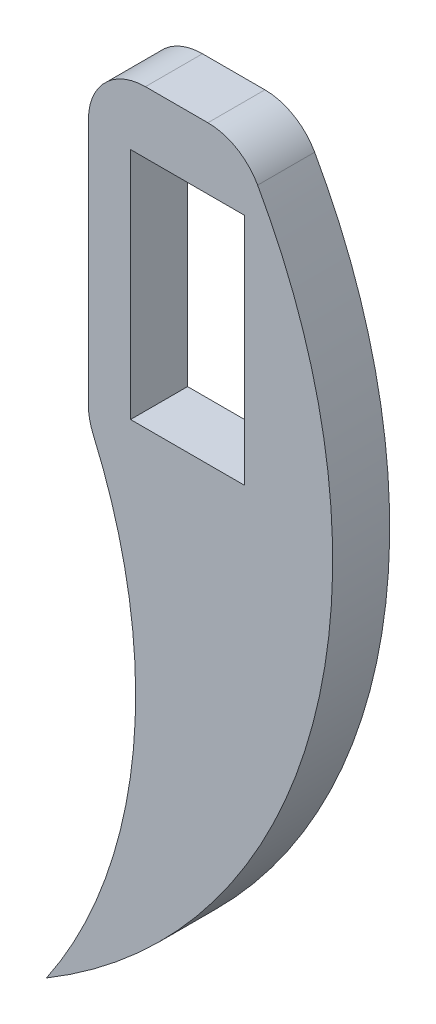
ISO-10303-21;
HEADER;
FILE_DESCRIPTION(('STEP AP214'),'2;1');
FILE_NAME('part.step','',(''),(''),'','','');
FILE_SCHEMA(('AUTOMOTIVE_DESIGN { 1 0 10303 214 1 1 1 1 }'));
ENDSEC;
DATA;
#1=APPLICATION_CONTEXT('core data for automotive mechanical design processes');
#2=APPLICATION_PROTOCOL_DEFINITION('international standard','automotive_design',2000,#1);
#3=PRODUCT_CONTEXT('',#1,'mechanical');
#4=PRODUCT('Part','Part','',(#3));
#5=PRODUCT_RELATED_PRODUCT_CATEGORY('part','',(#4));
#6=PRODUCT_DEFINITION_FORMATION('','',#4);
#7=PRODUCT_DEFINITION_CONTEXT('part definition',#1,'design');
#8=PRODUCT_DEFINITION('design','',#6,#7);
#9=PRODUCT_DEFINITION_SHAPE('','',#8);
#10=(LENGTH_UNIT() NAMED_UNIT(*) SI_UNIT(.MILLI.,.METRE.));
#11=(NAMED_UNIT(*) PLANE_ANGLE_UNIT() SI_UNIT($,.RADIAN.));
#12=(NAMED_UNIT(*) SI_UNIT($,.STERADIAN.) SOLID_ANGLE_UNIT());
#13=UNCERTAINTY_MEASURE_WITH_UNIT(LENGTH_MEASURE(1.E-05),#10,'distance_accuracy_value','');
#14=(GEOMETRIC_REPRESENTATION_CONTEXT(3) GLOBAL_UNCERTAINTY_ASSIGNED_CONTEXT((#13)) GLOBAL_UNIT_ASSIGNED_CONTEXT((#10,
#11,#12)) REPRESENTATION_CONTEXT('',''));
#15=CARTESIAN_POINT('',(0.,0.,0.));
#16=DIRECTION('',(0.,0.,1.));
#17=DIRECTION('',(1.,0.,0.));
#18=AXIS2_PLACEMENT_3D('',#15,#16,#17);
#19=CARTESIAN_POINT('',(-89.2649060375582,-82.4286037994864,10.));
#20=DIRECTION('',(0.,0.,1.));
#21=DIRECTION('',(1.,0.,0.));
#22=AXIS2_PLACEMENT_3D('',#19,#20,#21);
#23=PLANE('',#22);
#24=DIRECTION('',(0.,-1.,0.));
#25=VECTOR('',#24,1.);
#26=CARTESIAN_POINT('',(-7.39194451480431,10.8502665647734,10.));
#27=LINE('',#26,#25);
#28=CARTESIAN_POINT('',(-7.39194451480431,0.85026656477339,10.));
#29=VERTEX_POINT('',#28);
#30=CARTESIAN_POINT('',(-7.3919445148043,-42.5398529711621,10.));
#31=VERTEX_POINT('',#30);
#32=EDGE_CURVE('E172',#29,#31,#27,.T.);
#33=ORIENTED_EDGE('',*,*,#32,.T.);
#34=CARTESIAN_POINT('',(2.6080554851957,-42.5398529711621,10.));
#35=DIRECTION('',(0.,0.,1.));
#36=DIRECTION('',(1.,0.,0.));
#37=AXIS2_PLACEMENT_3D('',#34,#35,#36);
#38=CIRCLE('',#37,10.);
#39=CARTESIAN_POINT('',(-6.56468887205142,-46.5224100588372,10.));
#40=VERTEX_POINT('',#39);
#41=EDGE_CURVE('E45',#31,#40,#38,.T.);
#42=ORIENTED_EDGE('',*,*,#41,.T.);
#43=CARTESIAN_POINT('',(-89.2649060375582,-82.4286037994864,10.));
#44=DIRECTION('',(0.,0.,-1.));
#45=DIRECTION('',(1.,0.,0.));
#46=AXIS2_PLACEMENT_3D('',#43,#44,#45);
#47=CIRCLE('',#46,90.1586416721271);
#48=CARTESIAN_POINT('',(-14.7577899436033,-133.195426819299,10.));
#49=VERTEX_POINT('',#48);
#50=EDGE_CURVE('E164',#40,#49,#47,.T.);
#51=ORIENTED_EDGE('',*,*,#50,.T.);
#52=CARTESIAN_POINT('',(-67.7023851929773,-44.67414923242,10.));
#53=DIRECTION('',(0.,0.,1.));
#54=DIRECTION('',(-1.,0.,0.));
#55=AXIS2_PLACEMENT_3D('',#52,#53,#54);
#56=CIRCLE('',#55,103.146239639326);
#57=CARTESIAN_POINT('',(22.285359818908,5.73767973072294,10.));
#58=VERTEX_POINT('',#57);
#59=EDGE_CURVE('E166',#49,#58,#56,.T.);
#60=ORIENTED_EDGE('',*,*,#59,.T.);
#61=CARTESIAN_POINT('',(13.5610723095865,0.85026656477339,10.));
#62=DIRECTION('',(0.,0.,1.));
#63=DIRECTION('',(1.,0.,0.));
#64=AXIS2_PLACEMENT_3D('',#61,#62,#63);
#65=CIRCLE('',#64,10.);
#66=CARTESIAN_POINT('',(13.5610723095865,10.8502665647734,10.));
#67=VERTEX_POINT('',#66);
#68=EDGE_CURVE('E191',#58,#67,#65,.T.);
#69=ORIENTED_EDGE('',*,*,#68,.T.);
#70=DIRECTION('',(-1.,0.,0.));
#71=VECTOR('',#70,1.);
#72=CARTESIAN_POINT('',(-7.39194451480431,10.8502665647734,10.));
#73=LINE('',#72,#71);
#74=CARTESIAN_POINT('',(2.60805548519569,10.8502665647734,10.));
#75=VERTEX_POINT('',#74);
#76=EDGE_CURVE('E170',#67,#75,#73,.T.);
#77=ORIENTED_EDGE('',*,*,#76,.T.);
#78=CARTESIAN_POINT('',(2.60805548519569,0.850266564773392,10.));
#79=DIRECTION('',(0.,0.,1.));
#80=DIRECTION('',(1.,0.,0.));
#81=AXIS2_PLACEMENT_3D('',#78,#79,#80);
#82=CIRCLE('',#81,10.);
#83=EDGE_CURVE('E204',#75,#29,#82,.T.);
#84=ORIENTED_EDGE('',*,*,#83,.T.);
#85=EDGE_LOOP('',(#33,#42,#51,#60,#69,#77,#84));
#86=FACE_BOUND('',#85,.T.);
#87=DIRECTION('',(1.,0.,0.));
#88=VECTOR('',#87,1.);
#89=CARTESIAN_POINT('',(0.,-41.,10.));
#90=LINE('',#89,#88);
#91=CARTESIAN_POINT('',(0.,-41.,10.));
#92=VERTEX_POINT('',#91);
#93=CARTESIAN_POINT('',(20.,-41.,10.));
#94=VERTEX_POINT('',#93);
#95=EDGE_CURVE('E133',#92,#94,#90,.T.);
#96=ORIENTED_EDGE('',*,*,#95,.F.);
#97=DIRECTION('',(0.,-1.,0.));
#98=VECTOR('',#97,1.);
#99=CARTESIAN_POINT('',(0.,0.,10.));
#100=LINE('',#99,#98);
#101=CARTESIAN_POINT('',(0.,0.,10.));
#102=VERTEX_POINT('',#101);
#103=EDGE_CURVE('E123',#102,#92,#100,.T.);
#104=ORIENTED_EDGE('',*,*,#103,.F.);
#105=DIRECTION('',(-1.,0.,0.));
#106=VECTOR('',#105,1.);
#107=CARTESIAN_POINT('',(0.,0.,10.));
#108=LINE('',#107,#106);
#109=CARTESIAN_POINT('',(20.,0.,10.));
#110=VERTEX_POINT('',#109);
#111=EDGE_CURVE('E148',#110,#102,#108,.T.);
#112=ORIENTED_EDGE('',*,*,#111,.F.);
#113=DIRECTION('',(0.,1.,0.));
#114=VECTOR('',#113,1.);
#115=CARTESIAN_POINT('',(20.,0.,10.));
#116=LINE('',#115,#114);
#117=EDGE_CURVE('E146',#94,#110,#116,.T.);
#118=ORIENTED_EDGE('',*,*,#117,.F.);
#119=EDGE_LOOP('',(#96,#104,#112,#118));
#120=FACE_BOUND('',#119,.T.);
#121=ADVANCED_FACE('F37',(#86,#120),#23,.T.);
#122=CARTESIAN_POINT('',(-89.2649060375582,-82.4286037994864,0.));
#123=DIRECTION('',(0.,0.,1.));
#124=DIRECTION('',(1.,0.,0.));
#125=AXIS2_PLACEMENT_3D('',#122,#123,#124);
#126=PLANE('',#125);
#127=CARTESIAN_POINT('',(-89.2649060375582,-82.4286037994864,0.));
#128=DIRECTION('',(0.,0.,-1.));
#129=DIRECTION('',(1.,0.,0.));
#130=AXIS2_PLACEMENT_3D('',#127,#128,#129);
#131=CIRCLE('',#130,90.1586416721271);
#132=CARTESIAN_POINT('',(-6.56468887205142,-46.5224100588372,0.));
#133=VERTEX_POINT('',#132);
#134=CARTESIAN_POINT('',(-14.7577899436033,-133.195426819299,0.));
#135=VERTEX_POINT('',#134);
#136=EDGE_CURVE('E141',#133,#135,#131,.T.);
#137=ORIENTED_EDGE('',*,*,#136,.F.);
#138=CARTESIAN_POINT('',(2.6080554851957,-42.5398529711621,0.));
#139=DIRECTION('',(0.,0.,1.));
#140=DIRECTION('',(1.,0.,0.));
#141=AXIS2_PLACEMENT_3D('',#138,#139,#140);
#142=CIRCLE('',#141,10.);
#143=CARTESIAN_POINT('',(-7.3919445148043,-42.5398529711621,0.));
#144=VERTEX_POINT('',#143);
#145=EDGE_CURVE('E198',#133,#144,#142,.F.);
#146=ORIENTED_EDGE('',*,*,#145,.T.);
#147=DIRECTION('',(0.,-1.,0.));
#148=VECTOR('',#147,1.);
#149=CARTESIAN_POINT('',(-7.39194451480431,10.8502665647734,0.));
#150=LINE('',#149,#148);
#151=CARTESIAN_POINT('',(-7.39194451480431,0.85026656477339,0.));
#152=VERTEX_POINT('',#151);
#153=EDGE_CURVE('E167',#152,#144,#150,.T.);
#154=ORIENTED_EDGE('',*,*,#153,.F.);
#155=CARTESIAN_POINT('',(2.60805548519569,0.850266564773392,0.));
#156=DIRECTION('',(0.,0.,1.));
#157=DIRECTION('',(1.,0.,0.));
#158=AXIS2_PLACEMENT_3D('',#155,#156,#157);
#159=CIRCLE('',#158,10.);
#160=CARTESIAN_POINT('',(2.60805548519569,10.8502665647734,0.));
#161=VERTEX_POINT('',#160);
#162=EDGE_CURVE('E196',#152,#161,#159,.F.);
#163=ORIENTED_EDGE('',*,*,#162,.T.);
#164=DIRECTION('',(-1.,0.,0.));
#165=VECTOR('',#164,1.);
#166=CARTESIAN_POINT('',(-7.39194451480431,10.8502665647734,0.));
#167=LINE('',#166,#165);
#168=CARTESIAN_POINT('',(13.5610723095865,10.8502665647734,0.));
#169=VERTEX_POINT('',#168);
#170=EDGE_CURVE('E179',#169,#161,#167,.T.);
#171=ORIENTED_EDGE('',*,*,#170,.F.);
#172=CARTESIAN_POINT('',(13.5610723095865,0.85026656477339,0.));
#173=DIRECTION('',(0.,0.,1.));
#174=DIRECTION('',(1.,0.,0.));
#175=AXIS2_PLACEMENT_3D('',#172,#173,#174);
#176=CIRCLE('',#175,10.);
#177=CARTESIAN_POINT('',(22.285359818908,5.73767973072294,0.));
#178=VERTEX_POINT('',#177);
#179=EDGE_CURVE('E187',#169,#178,#176,.F.);
#180=ORIENTED_EDGE('',*,*,#179,.T.);
#181=CARTESIAN_POINT('',(-67.7023851929773,-44.67414923242,0.));
#182=DIRECTION('',(0.,0.,1.));
#183=DIRECTION('',(-1.,0.,0.));
#184=AXIS2_PLACEMENT_3D('',#181,#182,#183);
#185=CIRCLE('',#184,103.146239639326);
#186=EDGE_CURVE('E176',#135,#178,#185,.T.);
#187=ORIENTED_EDGE('',*,*,#186,.F.);
#188=EDGE_LOOP('',(#137,#146,#154,#163,#171,#180,#187));
#189=FACE_BOUND('',#188,.T.);
#190=DIRECTION('',(0.,-1.,0.));
#191=VECTOR('',#190,1.);
#192=CARTESIAN_POINT('',(0.,0.,0.));
#193=LINE('',#192,#191);
#194=CARTESIAN_POINT('',(0.,0.,0.));
#195=VERTEX_POINT('',#194);
#196=CARTESIAN_POINT('',(0.,-41.,0.));
#197=VERTEX_POINT('',#196);
#198=EDGE_CURVE('E152',#195,#197,#193,.T.);
#199=ORIENTED_EDGE('',*,*,#198,.T.);
#200=DIRECTION('',(1.,0.,0.));
#201=VECTOR('',#200,1.);
#202=CARTESIAN_POINT('',(0.,-41.,0.));
#203=LINE('',#202,#201);
#204=CARTESIAN_POINT('',(20.,-41.,0.));
#205=VERTEX_POINT('',#204);
#206=EDGE_CURVE('E140',#197,#205,#203,.T.);
#207=ORIENTED_EDGE('',*,*,#206,.T.);
#208=DIRECTION('',(0.,1.,0.));
#209=VECTOR('',#208,1.);
#210=CARTESIAN_POINT('',(20.,0.,0.));
#211=LINE('',#210,#209);
#212=CARTESIAN_POINT('',(20.,0.,0.));
#213=VERTEX_POINT('',#212);
#214=EDGE_CURVE('E155',#205,#213,#211,.T.);
#215=ORIENTED_EDGE('',*,*,#214,.T.);
#216=DIRECTION('',(-1.,0.,0.));
#217=VECTOR('',#216,1.);
#218=CARTESIAN_POINT('',(0.,0.,0.));
#219=LINE('',#218,#217);
#220=EDGE_CURVE('E134',#213,#195,#219,.T.);
#221=ORIENTED_EDGE('',*,*,#220,.T.);
#222=EDGE_LOOP('',(#199,#207,#215,#221));
#223=FACE_BOUND('',#222,.T.);
#224=ADVANCED_FACE('F218',(#189,#223),#126,.F.);
#225=CARTESIAN_POINT('',(-89.2649060375582,-82.4286037994864,10.));
#226=DIRECTION('',(0.,0.,-1.));
#227=DIRECTION('',(-1.,0.,0.));
#228=AXIS2_PLACEMENT_3D('',#225,#226,#227);
#229=CYLINDRICAL_SURFACE('',#228,90.1586416721271);
#230=ORIENTED_EDGE('',*,*,#50,.F.);
#231=DIRECTION('',(0.,0.,-1.));
#232=VECTOR('',#231,1.);
#233=CARTESIAN_POINT('',(-6.5646888720514,-46.5224100588372,10.));
#234=LINE('',#233,#232);
#235=EDGE_CURVE('E193',#40,#133,#234,.T.);
#236=ORIENTED_EDGE('',*,*,#235,.T.);
#237=ORIENTED_EDGE('',*,*,#136,.T.);
#238=DIRECTION('',(0.,0.,-1.));
#239=VECTOR('',#238,1.);
#240=CARTESIAN_POINT('',(-14.7577899436033,-133.195426819299,10.));
#241=LINE('',#240,#239);
#242=EDGE_CURVE('E174',#49,#135,#241,.T.);
#243=ORIENTED_EDGE('',*,*,#242,.F.);
#244=EDGE_LOOP('',(#230,#236,#237,#243));
#245=FACE_BOUND('',#244,.T.);
#246=ADVANCED_FACE('F213',(#245),#229,.F.);
#247=CARTESIAN_POINT('',(-67.7023851929773,-44.67414923242,10.));
#248=DIRECTION('',(0.,0.,-1.));
#249=DIRECTION('',(-1.,0.,0.));
#250=AXIS2_PLACEMENT_3D('',#247,#248,#249);
#251=CYLINDRICAL_SURFACE('',#250,103.146239639326);
#252=ORIENTED_EDGE('',*,*,#186,.T.);
#253=DIRECTION('',(0.,0.,-1.));
#254=VECTOR('',#253,1.);
#255=CARTESIAN_POINT('',(22.285359818908,5.73767973072294,10.));
#256=LINE('',#255,#254);
#257=EDGE_CURVE('E189',#178,#58,#256,.F.);
#258=ORIENTED_EDGE('',*,*,#257,.T.);
#259=ORIENTED_EDGE('',*,*,#59,.F.);
#260=ORIENTED_EDGE('',*,*,#242,.T.);
#261=EDGE_LOOP('',(#252,#258,#259,#260));
#262=FACE_BOUND('',#261,.T.);
#263=ADVANCED_FACE('F233',(#262),#251,.T.);
#264=CARTESIAN_POINT('',(-7.39194451480431,10.8502665647734,10.));
#265=DIRECTION('',(0.,-1.,0.));
#266=DIRECTION('',(0.,0.,-1.));
#267=AXIS2_PLACEMENT_3D('',#264,#265,#266);
#268=PLANE('',#267);
#269=ORIENTED_EDGE('',*,*,#170,.T.);
#270=DIRECTION('',(0.,0.,-1.));
#271=VECTOR('',#270,1.);
#272=CARTESIAN_POINT('',(2.60805548519569,10.8502665647734,10.));
#273=LINE('',#272,#271);
#274=EDGE_CURVE('E11',#161,#75,#273,.F.);
#275=ORIENTED_EDGE('',*,*,#274,.T.);
#276=ORIENTED_EDGE('',*,*,#76,.F.);
#277=DIRECTION('',(0.,0.,-1.));
#278=VECTOR('',#277,1.);
#279=CARTESIAN_POINT('',(13.5610723095865,10.8502665647734,10.));
#280=LINE('',#279,#278);
#281=EDGE_CURVE('E184',#67,#169,#280,.T.);
#282=ORIENTED_EDGE('',*,*,#281,.T.);
#283=EDGE_LOOP('',(#269,#275,#276,#282));
#284=FACE_BOUND('',#283,.T.);
#285=ADVANCED_FACE('F226',(#284),#268,.F.);
#286=CARTESIAN_POINT('',(-7.39194451480431,10.8502665647734,10.));
#287=DIRECTION('',(1.,0.,0.));
#288=DIRECTION('',(0.,1.,0.));
#289=AXIS2_PLACEMENT_3D('',#286,#287,#288);
#290=PLANE('',#289);
#291=ORIENTED_EDGE('',*,*,#153,.T.);
#292=DIRECTION('',(0.,0.,-1.));
#293=VECTOR('',#292,1.);
#294=CARTESIAN_POINT('',(-7.3919445148043,-42.5398529711621,10.));
#295=LINE('',#294,#293);
#296=EDGE_CURVE('E58',#144,#31,#295,.F.);
#297=ORIENTED_EDGE('',*,*,#296,.T.);
#298=ORIENTED_EDGE('',*,*,#32,.F.);
#299=DIRECTION('',(0.,0.,-1.));
#300=VECTOR('',#299,1.);
#301=CARTESIAN_POINT('',(-7.39194451480431,0.85026656477339,10.));
#302=LINE('',#301,#300);
#303=EDGE_CURVE('E200',#29,#152,#302,.T.);
#304=ORIENTED_EDGE('',*,*,#303,.T.);
#305=EDGE_LOOP('',(#291,#297,#298,#304));
#306=FACE_BOUND('',#305,.T.);
#307=ADVANCED_FACE('F221',(#306),#290,.F.);
#308=CARTESIAN_POINT('',(0.,0.,10.));
#309=DIRECTION('',(1.,0.,0.));
#310=DIRECTION('',(0.,1.,0.));
#311=AXIS2_PLACEMENT_3D('',#308,#309,#310);
#312=PLANE('',#311);
#313=ORIENTED_EDGE('',*,*,#198,.F.);
#314=DIRECTION('',(0.,0.,-1.));
#315=VECTOR('',#314,1.);
#316=CARTESIAN_POINT('',(0.,0.,10.));
#317=LINE('',#316,#315);
#318=EDGE_CURVE('E129',#102,#195,#317,.T.);
#319=ORIENTED_EDGE('',*,*,#318,.F.);
#320=ORIENTED_EDGE('',*,*,#103,.T.);
#321=DIRECTION('',(0.,0.,-1.));
#322=VECTOR('',#321,1.);
#323=CARTESIAN_POINT('',(0.,-41.,10.));
#324=LINE('',#323,#322);
#325=EDGE_CURVE('E126',#92,#197,#324,.T.);
#326=ORIENTED_EDGE('',*,*,#325,.T.);
#327=EDGE_LOOP('',(#313,#319,#320,#326));
#328=FACE_BOUND('',#327,.T.);
#329=ADVANCED_FACE('F125',(#328),#312,.T.);
#330=CARTESIAN_POINT('',(0.,-41.,10.));
#331=DIRECTION('',(0.,1.,0.));
#332=DIRECTION('',(0.,0.,1.));
#333=AXIS2_PLACEMENT_3D('',#330,#331,#332);
#334=PLANE('',#333);
#335=ORIENTED_EDGE('',*,*,#206,.F.);
#336=ORIENTED_EDGE('',*,*,#325,.F.);
#337=ORIENTED_EDGE('',*,*,#95,.T.);
#338=DIRECTION('',(0.,0.,-1.));
#339=VECTOR('',#338,1.);
#340=CARTESIAN_POINT('',(20.,-41.,10.));
#341=LINE('',#340,#339);
#342=EDGE_CURVE('E142',#94,#205,#341,.T.);
#343=ORIENTED_EDGE('',*,*,#342,.T.);
#344=EDGE_LOOP('',(#335,#336,#337,#343));
#345=FACE_BOUND('',#344,.T.);
#346=ADVANCED_FACE('F137',(#345),#334,.T.);
#347=CARTESIAN_POINT('',(20.,0.,10.));
#348=DIRECTION('',(-1.,0.,0.));
#349=DIRECTION('',(0.,-1.,0.));
#350=AXIS2_PLACEMENT_3D('',#347,#348,#349);
#351=PLANE('',#350);
#352=ORIENTED_EDGE('',*,*,#214,.F.);
#353=ORIENTED_EDGE('',*,*,#342,.F.);
#354=ORIENTED_EDGE('',*,*,#117,.T.);
#355=DIRECTION('',(0.,0.,-1.));
#356=VECTOR('',#355,1.);
#357=CARTESIAN_POINT('',(20.,0.,10.));
#358=LINE('',#357,#356);
#359=EDGE_CURVE('E161',#110,#213,#358,.T.);
#360=ORIENTED_EDGE('',*,*,#359,.T.);
#361=EDGE_LOOP('',(#352,#353,#354,#360));
#362=FACE_BOUND('',#361,.T.);
#363=ADVANCED_FACE('F258',(#362),#351,.T.);
#364=CARTESIAN_POINT('',(0.,0.,10.));
#365=DIRECTION('',(0.,-1.,0.));
#366=DIRECTION('',(0.,0.,-1.));
#367=AXIS2_PLACEMENT_3D('',#364,#365,#366);
#368=PLANE('',#367);
#369=ORIENTED_EDGE('',*,*,#220,.F.);
#370=ORIENTED_EDGE('',*,*,#359,.F.);
#371=ORIENTED_EDGE('',*,*,#111,.T.);
#372=ORIENTED_EDGE('',*,*,#318,.T.);
#373=EDGE_LOOP('',(#369,#370,#371,#372));
#374=FACE_BOUND('',#373,.T.);
#375=ADVANCED_FACE('F262',(#374),#368,.T.);
#376=CARTESIAN_POINT('',(13.5610723095865,0.85026656477339,10.));
#377=DIRECTION('',(0.,0.,-1.));
#378=DIRECTION('',(-1.,0.,0.));
#379=AXIS2_PLACEMENT_3D('',#376,#377,#378);
#380=CYLINDRICAL_SURFACE('',#379,10.);
#381=ORIENTED_EDGE('',*,*,#68,.F.);
#382=ORIENTED_EDGE('',*,*,#257,.F.);
#383=ORIENTED_EDGE('',*,*,#179,.F.);
#384=ORIENTED_EDGE('',*,*,#281,.F.);
#385=EDGE_LOOP('',(#381,#382,#383,#384));
#386=FACE_BOUND('',#385,.T.);
#387=ADVANCED_FACE('F230',(#386),#380,.T.);
#388=CARTESIAN_POINT('',(2.6080554851957,-42.5398529711621,10.));
#389=DIRECTION('',(0.,0.,-1.));
#390=DIRECTION('',(-1.,0.,0.));
#391=AXIS2_PLACEMENT_3D('',#388,#389,#390);
#392=CYLINDRICAL_SURFACE('',#391,10.);
#393=ORIENTED_EDGE('',*,*,#41,.F.);
#394=ORIENTED_EDGE('',*,*,#296,.F.);
#395=ORIENTED_EDGE('',*,*,#145,.F.);
#396=ORIENTED_EDGE('',*,*,#235,.F.);
#397=EDGE_LOOP('',(#393,#394,#395,#396));
#398=FACE_BOUND('',#397,.T.);
#399=ADVANCED_FACE('F215',(#398),#392,.T.);
#400=CARTESIAN_POINT('',(2.60805548519569,0.850266564773392,10.));
#401=DIRECTION('',(0.,0.,-1.));
#402=DIRECTION('',(-1.,0.,0.));
#403=AXIS2_PLACEMENT_3D('',#400,#401,#402);
#404=CYLINDRICAL_SURFACE('',#403,10.);
#405=ORIENTED_EDGE('',*,*,#83,.F.);
#406=ORIENTED_EDGE('',*,*,#274,.F.);
#407=ORIENTED_EDGE('',*,*,#162,.F.);
#408=ORIENTED_EDGE('',*,*,#303,.F.);
#409=EDGE_LOOP('',(#405,#406,#407,#408));
#410=FACE_BOUND('',#409,.T.);
#411=ADVANCED_FACE('F39',(#410),#404,.T.);
#412=CLOSED_SHELL('',(#121,#224,#246,#263,#285,#307,#329,#346,#363,#375,#387,#399,#411));
#413=MANIFOLD_SOLID_BREP('B2',#412);
#414=ADVANCED_BREP_SHAPE_REPRESENTATION('',(#18,#413),#14);
#415=SHAPE_DEFINITION_REPRESENTATION(#9,#414);
ENDSEC;
END-ISO-10303-21;
